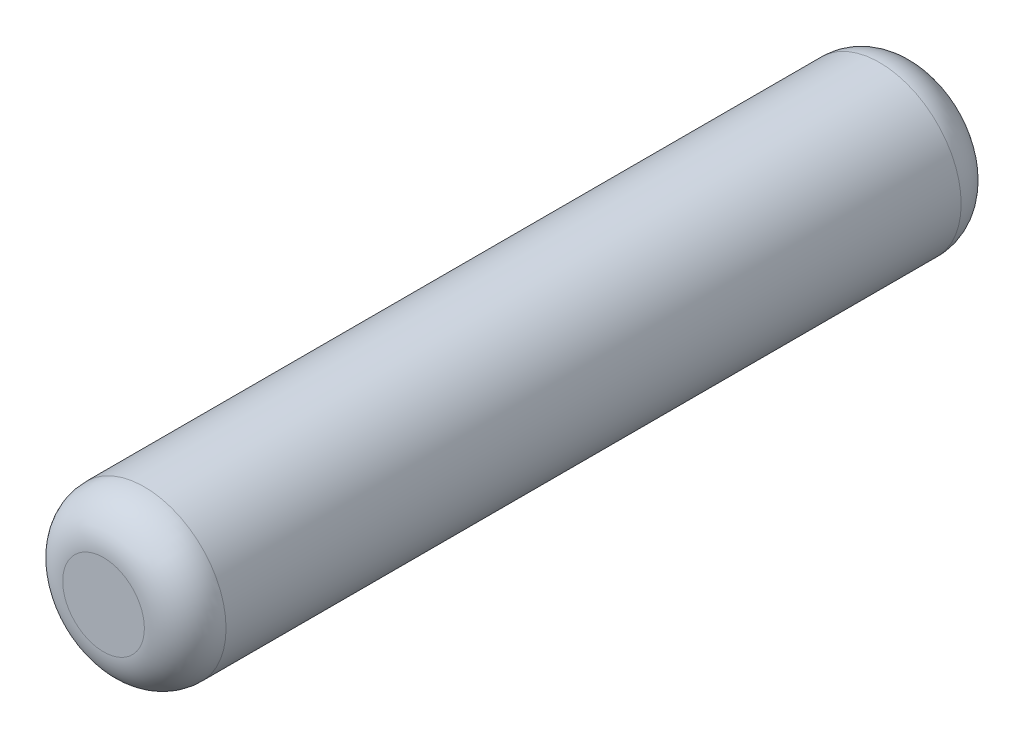
ISO-10303-21;
HEADER;
FILE_DESCRIPTION(('STEP AP214'),'2;1');
FILE_NAME('part.step','',(''),(''),'','','');
FILE_SCHEMA(('AUTOMOTIVE_DESIGN { 1 0 10303 214 1 1 1 1 }'));
ENDSEC;
DATA;
#1=APPLICATION_CONTEXT('core data for automotive mechanical design processes');
#2=APPLICATION_PROTOCOL_DEFINITION('international standard','automotive_design',2000,#1);
#3=PRODUCT_CONTEXT('',#1,'mechanical');
#4=PRODUCT('Part','Part','',(#3));
#5=PRODUCT_RELATED_PRODUCT_CATEGORY('part','',(#4));
#6=PRODUCT_DEFINITION_FORMATION('','',#4);
#7=PRODUCT_DEFINITION_CONTEXT('part definition',#1,'design');
#8=PRODUCT_DEFINITION('design','',#6,#7);
#9=PRODUCT_DEFINITION_SHAPE('','',#8);
#10=(LENGTH_UNIT() NAMED_UNIT(*) SI_UNIT(.MILLI.,.METRE.));
#11=(NAMED_UNIT(*) PLANE_ANGLE_UNIT() SI_UNIT($,.RADIAN.));
#12=(NAMED_UNIT(*) SI_UNIT($,.STERADIAN.) SOLID_ANGLE_UNIT());
#13=UNCERTAINTY_MEASURE_WITH_UNIT(LENGTH_MEASURE(1.E-05),#10,'distance_accuracy_value','');
#14=(GEOMETRIC_REPRESENTATION_CONTEXT(3) GLOBAL_UNCERTAINTY_ASSIGNED_CONTEXT((#13)) GLOBAL_UNIT_ASSIGNED_CONTEXT((#10,
#11,#12)) REPRESENTATION_CONTEXT('',''));
#15=CARTESIAN_POINT('',(0.,0.,0.));
#16=DIRECTION('',(0.,0.,1.));
#17=DIRECTION('',(1.,0.,0.));
#18=AXIS2_PLACEMENT_3D('',#15,#16,#17);
#19=CARTESIAN_POINT('',(0.,0.,10.));
#20=DIRECTION('',(0.,0.,-1.));
#21=DIRECTION('',(-1.,0.,0.));
#22=AXIS2_PLACEMENT_3D('',#19,#20,#21);
#23=CYLINDRICAL_SURFACE('',#22,1.);
#24=CARTESIAN_POINT('',(0.,0.,0.5));
#25=DIRECTION('',(0.,0.,1.));
#26=DIRECTION('',(1.,0.,0.));
#27=AXIS2_PLACEMENT_3D('',#24,#25,#26);
#28=CIRCLE('',#27,1.);
#29=CARTESIAN_POINT('',(1.,0.,0.5));
#30=VERTEX_POINT('',#29);
#31=EDGE_CURVE('E44',#30,#30,#28,.T.);
#32=ORIENTED_EDGE('',*,*,#31,.T.);
#33=EDGE_LOOP('',(#32));
#34=FACE_BOUND('',#33,.T.);
#35=CARTESIAN_POINT('',(0.,0.,9.5));
#36=DIRECTION('',(0.,0.,1.));
#37=DIRECTION('',(1.,0.,0.));
#38=AXIS2_PLACEMENT_3D('',#35,#36,#37);
#39=CIRCLE('',#38,1.);
#40=CARTESIAN_POINT('',(1.,0.,9.5));
#41=VERTEX_POINT('',#40);
#42=EDGE_CURVE('E48',#41,#41,#39,.F.);
#43=ORIENTED_EDGE('',*,*,#42,.T.);
#44=EDGE_LOOP('',(#43));
#45=FACE_BOUND('',#44,.T.);
#46=ADVANCED_FACE('F33',(#34,#45),#23,.T.);
#47=CARTESIAN_POINT('',(0.,0.,10.));
#48=DIRECTION('',(0.,0.,1.));
#49=DIRECTION('',(1.,0.,0.));
#50=AXIS2_PLACEMENT_3D('',#47,#48,#49);
#51=PLANE('',#50);
#52=CARTESIAN_POINT('',(0.,0.,10.));
#53=DIRECTION('',(0.,0.,1.));
#54=DIRECTION('',(1.,0.,0.));
#55=AXIS2_PLACEMENT_3D('',#52,#53,#54);
#56=CIRCLE('',#55,0.5);
#57=CARTESIAN_POINT('',(0.5,0.,10.));
#58=VERTEX_POINT('',#57);
#59=EDGE_CURVE('E10',#58,#58,#56,.T.);
#60=ORIENTED_EDGE('',*,*,#59,.T.);
#61=EDGE_LOOP('',(#60));
#62=FACE_BOUND('',#61,.T.);
#63=ADVANCED_FACE('F64',(#62),#51,.T.);
#64=CARTESIAN_POINT('',(0.,0.,0.));
#65=DIRECTION('',(0.,0.,1.));
#66=DIRECTION('',(1.,0.,0.));
#67=AXIS2_PLACEMENT_3D('',#64,#65,#66);
#68=PLANE('',#67);
#69=CARTESIAN_POINT('',(0.,0.,0.));
#70=DIRECTION('',(0.,0.,1.));
#71=DIRECTION('',(1.,0.,0.));
#72=AXIS2_PLACEMENT_3D('',#69,#70,#71);
#73=CIRCLE('',#72,0.5);
#74=CARTESIAN_POINT('',(0.5,0.,0.));
#75=VERTEX_POINT('',#74);
#76=EDGE_CURVE('E40',#75,#75,#73,.F.);
#77=ORIENTED_EDGE('',*,*,#76,.T.);
#78=EDGE_LOOP('',(#77));
#79=FACE_BOUND('',#78,.T.);
#80=ADVANCED_FACE('F61',(#79),#68,.F.);
#81=CARTESIAN_POINT('',(0.,0.,0.5));
#82=DIRECTION('',(0.,0.,1.));
#83=DIRECTION('',(1.,0.,0.));
#84=AXIS2_PLACEMENT_3D('',#81,#82,#83);
#85=DEGENERATE_TOROIDAL_SURFACE('',#84,0.5,0.5,.T.);
#86=ORIENTED_EDGE('',*,*,#76,.F.);
#87=EDGE_LOOP('',(#86));
#88=FACE_BOUND('',#87,.T.);
#89=ORIENTED_EDGE('',*,*,#31,.F.);
#90=EDGE_LOOP('',(#89));
#91=FACE_BOUND('',#90,.T.);
#92=ADVANCED_FACE('F57',(#88,#91),#85,.T.);
#93=CARTESIAN_POINT('',(0.,0.,9.5));
#94=DIRECTION('',(0.,0.,1.));
#95=DIRECTION('',(1.,0.,0.));
#96=AXIS2_PLACEMENT_3D('',#93,#94,#95);
#97=DEGENERATE_TOROIDAL_SURFACE('',#96,0.5,0.5,.T.);
#98=ORIENTED_EDGE('',*,*,#42,.F.);
#99=EDGE_LOOP('',(#98));
#100=FACE_BOUND('',#99,.T.);
#101=ORIENTED_EDGE('',*,*,#59,.F.);
#102=EDGE_LOOP('',(#101));
#103=FACE_BOUND('',#102,.T.);
#104=ADVANCED_FACE('F35',(#100,#103),#97,.T.);
#105=CLOSED_SHELL('',(#46,#63,#80,#92,#104));
#106=MANIFOLD_SOLID_BREP('B2',#105);
#107=ADVANCED_BREP_SHAPE_REPRESENTATION('',(#18,#106),#14);
#108=SHAPE_DEFINITION_REPRESENTATION(#9,#107);
ENDSEC;
END-ISO-10303-21;
